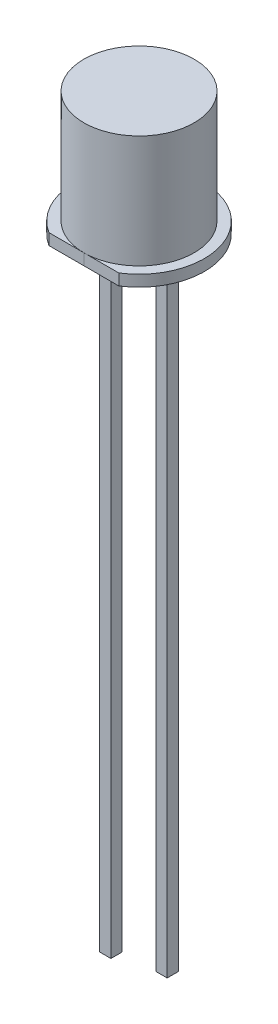
ISO-10303-21;
HEADER;
FILE_DESCRIPTION(('STEP AP214'),'2;1');
FILE_NAME('part.step','',(''),(''),'','','');
FILE_SCHEMA(('AUTOMOTIVE_DESIGN { 1 0 10303 214 1 1 1 1 }'));
ENDSEC;
DATA;
#1=APPLICATION_CONTEXT('core data for automotive mechanical design processes');
#2=APPLICATION_PROTOCOL_DEFINITION('international standard','automotive_design',2000,#1);
#3=PRODUCT_CONTEXT('',#1,'mechanical');
#4=PRODUCT('Part','Part','',(#3));
#5=PRODUCT_RELATED_PRODUCT_CATEGORY('part','',(#4));
#6=PRODUCT_DEFINITION_FORMATION('','',#4);
#7=PRODUCT_DEFINITION_CONTEXT('part definition',#1,'design');
#8=PRODUCT_DEFINITION('design','',#6,#7);
#9=PRODUCT_DEFINITION_SHAPE('','',#8);
#10=(LENGTH_UNIT() NAMED_UNIT(*) SI_UNIT(.MILLI.,.METRE.));
#11=(NAMED_UNIT(*) PLANE_ANGLE_UNIT() SI_UNIT($,.RADIAN.));
#12=(NAMED_UNIT(*) SI_UNIT($,.STERADIAN.) SOLID_ANGLE_UNIT());
#13=UNCERTAINTY_MEASURE_WITH_UNIT(LENGTH_MEASURE(1.E-05),#10,'distance_accuracy_value','');
#14=(GEOMETRIC_REPRESENTATION_CONTEXT(3) GLOBAL_UNCERTAINTY_ASSIGNED_CONTEXT((#13)) GLOBAL_UNIT_ASSIGNED_CONTEXT((#10,
#11,#12)) REPRESENTATION_CONTEXT('',''));
#15=CARTESIAN_POINT('',(0.,0.,0.));
#16=DIRECTION('',(0.,0.,1.));
#17=DIRECTION('',(1.,0.,0.));
#18=AXIS2_PLACEMENT_3D('',#15,#16,#17);
#19=CARTESIAN_POINT('',(0.,0.,-0.225));
#20=DIRECTION('',(0.,1.,0.));
#21=DIRECTION('',(1.,0.,0.));
#22=AXIS2_PLACEMENT_3D('',#19,#20,#21);
#23=PLANE('',#22);
#24=CARTESIAN_POINT('',(0.,0.,0.));
#25=DIRECTION('',(0.,1.,0.));
#26=DIRECTION('',(0.535038643075272,0.,0.844827586206897));
#27=AXIS2_PLACEMENT_3D('',#24,#25,#26);
#28=CIRCLE('',#27,2.9);
#29=CARTESIAN_POINT('',(1.55161206491829,0.,2.45));
#30=VERTEX_POINT('',#29);
#31=CARTESIAN_POINT('',(-1.55161206491829,0.,2.45));
#32=VERTEX_POINT('',#31);
#33=EDGE_CURVE('P0_E26',#30,#32,#28,.T.);
#34=ORIENTED_EDGE('',*,*,#33,.F.);
#35=DIRECTION('',(1.,0.,0.));
#36=VECTOR('',#35,1.);
#37=CARTESIAN_POINT('',(-1.55161206491829,0.,2.45));
#38=LINE('',#37,#36);
#39=CARTESIAN_POINT('',(0.,0.,2.45));
#40=VERTEX_POINT('',#39);
#41=EDGE_CURVE('P0_E101',#40,#30,#38,.T.);
#42=ORIENTED_EDGE('',*,*,#41,.F.);
#43=CARTESIAN_POINT('',(0.,0.,0.));
#44=DIRECTION('',(0.,1.,0.));
#45=DIRECTION('',(1.,0.,0.));
#46=AXIS2_PLACEMENT_3D('',#43,#44,#45);
#47=CIRCLE('',#46,2.45);
#48=CARTESIAN_POINT('',(-2.45,0.,0.));
#49=VERTEX_POINT('',#48);
#50=EDGE_CURVE('P0_E114',#40,#49,#47,.T.);
#51=ORIENTED_EDGE('',*,*,#50,.T.);
#52=CARTESIAN_POINT('',(0.,0.,0.));
#53=DIRECTION('',(0.,1.,0.));
#54=DIRECTION('',(1.,0.,0.));
#55=AXIS2_PLACEMENT_3D('',#52,#53,#54);
#56=CIRCLE('',#55,2.45);
#57=CARTESIAN_POINT('',(0.,0.,2.45));
#58=VERTEX_POINT('',#57);
#59=EDGE_CURVE('P0_E108',#49,#58,#56,.T.);
#60=ORIENTED_EDGE('',*,*,#59,.T.);
#61=DIRECTION('',(1.,0.,0.));
#62=VECTOR('',#61,1.);
#63=CARTESIAN_POINT('',(-1.55161206491829,0.,2.45));
#64=LINE('',#63,#62);
#65=EDGE_CURVE('P0_E113',#32,#58,#64,.T.);
#66=ORIENTED_EDGE('',*,*,#65,.F.);
#67=EDGE_LOOP('',(#34,#42,#51,#60,#66));
#68=FACE_BOUND('',#67,.T.);
#69=ADVANCED_FACE('P0_F16',(#68),#23,.F.);
#70=CARTESIAN_POINT('',(0.,0.5,-0.225));
#71=DIRECTION('',(0.,1.,0.));
#72=DIRECTION('',(1.,0.,0.));
#73=AXIS2_PLACEMENT_3D('',#70,#71,#72);
#74=PLANE('',#73);
#75=CARTESIAN_POINT('',(0.,0.5,0.));
#76=DIRECTION('',(0.,1.,0.));
#77=DIRECTION('',(0.535038643075272,0.,0.844827586206897));
#78=AXIS2_PLACEMENT_3D('',#75,#76,#77);
#79=CIRCLE('',#78,2.9);
#80=CARTESIAN_POINT('',(1.55161206491829,0.5,2.45));
#81=VERTEX_POINT('',#80);
#82=CARTESIAN_POINT('',(-1.55161206491829,0.5,2.45));
#83=VERTEX_POINT('',#82);
#84=EDGE_CURVE('P0_E10',#81,#83,#79,.T.);
#85=ORIENTED_EDGE('',*,*,#84,.T.);
#86=DIRECTION('',(1.,0.,0.));
#87=VECTOR('',#86,1.);
#88=CARTESIAN_POINT('',(-1.55161206491829,0.5,2.45));
#89=LINE('',#88,#87);
#90=CARTESIAN_POINT('',(0.,0.5,2.45));
#91=VERTEX_POINT('',#90);
#92=EDGE_CURVE('P0_E138',#83,#91,#89,.T.);
#93=ORIENTED_EDGE('',*,*,#92,.T.);
#94=CARTESIAN_POINT('',(0.,0.5,0.));
#95=DIRECTION('',(0.,-1.,0.));
#96=DIRECTION('',(1.,0.,0.));
#97=AXIS2_PLACEMENT_3D('',#94,#95,#96);
#98=CIRCLE('',#97,2.45);
#99=CARTESIAN_POINT('',(-2.45,0.5,0.));
#100=VERTEX_POINT('',#99);
#101=EDGE_CURVE('P0_E39',#91,#100,#98,.T.);
#102=ORIENTED_EDGE('',*,*,#101,.T.);
#103=CARTESIAN_POINT('',(0.,0.5,0.));
#104=DIRECTION('',(0.,-1.,0.));
#105=DIRECTION('',(1.,0.,0.));
#106=AXIS2_PLACEMENT_3D('',#103,#104,#105);
#107=CIRCLE('',#106,2.45);
#108=CARTESIAN_POINT('',(0.,0.5,2.45));
#109=VERTEX_POINT('',#108);
#110=EDGE_CURVE('P0_E93',#100,#109,#107,.T.);
#111=ORIENTED_EDGE('',*,*,#110,.T.);
#112=DIRECTION('',(1.,0.,0.));
#113=VECTOR('',#112,1.);
#114=CARTESIAN_POINT('',(-1.55161206491829,0.5,2.45));
#115=LINE('',#114,#113);
#116=EDGE_CURVE('P0_E92',#109,#81,#115,.T.);
#117=ORIENTED_EDGE('',*,*,#116,.T.);
#118=EDGE_LOOP('',(#85,#93,#102,#111,#117));
#119=FACE_BOUND('',#118,.T.);
#120=ADVANCED_FACE('P0_F18',(#119),#74,.T.);
#121=CARTESIAN_POINT('',(0.,0.,0.));
#122=DIRECTION('',(0.,1.,0.));
#123=DIRECTION('',(0.,0.,-1.));
#124=AXIS2_PLACEMENT_3D('',#121,#122,#123);
#125=CYLINDRICAL_SURFACE('',#124,2.9);
#126=ORIENTED_EDGE('',*,*,#33,.T.);
#127=DIRECTION('',(0.,1.,0.));
#128=VECTOR('',#127,1.);
#129=CARTESIAN_POINT('',(-1.55161206491829,0.,2.45));
#130=LINE('',#129,#128);
#131=EDGE_CURVE('P0_E87',#32,#83,#130,.T.);
#132=ORIENTED_EDGE('',*,*,#131,.T.);
#133=ORIENTED_EDGE('',*,*,#84,.F.);
#134=DIRECTION('',(0.,1.,0.));
#135=VECTOR('',#134,1.);
#136=CARTESIAN_POINT('',(1.55161206491829,0.,2.45));
#137=LINE('',#136,#135);
#138=EDGE_CURVE('P0_E84',#30,#81,#137,.T.);
#139=ORIENTED_EDGE('',*,*,#138,.F.);
#140=EDGE_LOOP('',(#126,#132,#133,#139));
#141=FACE_BOUND('',#140,.T.);
#142=ADVANCED_FACE('P0_F82',(#141),#125,.T.);
#143=CARTESIAN_POINT('',(-1.55161206491829,0.,2.45));
#144=DIRECTION('',(0.,0.,1.));
#145=DIRECTION('',(1.,0.,0.));
#146=AXIS2_PLACEMENT_3D('',#143,#144,#145);
#147=PLANE('',#146);
#148=ORIENTED_EDGE('',*,*,#65,.T.);
#149=DIRECTION('',(0.,1.,0.));
#150=VECTOR('',#149,1.);
#151=CARTESIAN_POINT('',(0.,0.,2.45));
#152=LINE('',#151,#150);
#153=EDGE_CURVE('P0_E45',#58,#91,#152,.T.);
#154=ORIENTED_EDGE('',*,*,#153,.T.);
#155=ORIENTED_EDGE('',*,*,#92,.F.);
#156=ORIENTED_EDGE('',*,*,#131,.F.);
#157=EDGE_LOOP('',(#148,#154,#155,#156));
#158=FACE_BOUND('',#157,.T.);
#159=ADVANCED_FACE('P0_F210',(#158),#147,.T.);
#160=CARTESIAN_POINT('',(0.,0.,0.));
#161=DIRECTION('',(0.,1.,0.));
#162=DIRECTION('',(1.,0.,0.));
#163=AXIS2_PLACEMENT_3D('',#160,#161,#162);
#164=CYLINDRICAL_SURFACE('',#163,2.45);
#165=DIRECTION('',(0.,-1.,0.));
#166=VECTOR('',#165,1.);
#167=CARTESIAN_POINT('',(-2.45,0.,0.));
#168=LINE('',#167,#166);
#169=EDGE_CURVE('P0_E116',#100,#49,#168,.T.);
#170=ORIENTED_EDGE('',*,*,#169,.T.);
#171=ORIENTED_EDGE('',*,*,#50,.F.);
#172=DIRECTION('',(0.,1.,0.));
#173=VECTOR('',#172,1.);
#174=CARTESIAN_POINT('',(0.,0.,2.45));
#175=LINE('',#174,#173);
#176=EDGE_CURVE('P0_E20',#40,#109,#175,.T.);
#177=ORIENTED_EDGE('',*,*,#176,.T.);
#178=ORIENTED_EDGE('',*,*,#110,.F.);
#179=EDGE_LOOP('',(#170,#171,#177,#178));
#180=FACE_BOUND('',#179,.T.);
#181=ADVANCED_FACE('P0_F200',(#180),#164,.F.);
#182=CARTESIAN_POINT('',(0.,0.,2.45));
#183=DIRECTION('',(0.,0.,1.));
#184=DIRECTION('',(1.,0.,0.));
#185=AXIS2_PLACEMENT_3D('',#182,#183,#184);
#186=PLANE('',#185);
#187=ORIENTED_EDGE('',*,*,#41,.T.);
#188=ORIENTED_EDGE('',*,*,#138,.T.);
#189=ORIENTED_EDGE('',*,*,#116,.F.);
#190=ORIENTED_EDGE('',*,*,#176,.F.);
#191=EDGE_LOOP('',(#187,#188,#189,#190));
#192=FACE_BOUND('',#191,.T.);
#193=ADVANCED_FACE('P0_F99',(#192),#186,.T.);
#194=CARTESIAN_POINT('',(0.,0.,0.));
#195=DIRECTION('',(0.,1.,0.));
#196=DIRECTION('',(1.,0.,0.));
#197=AXIS2_PLACEMENT_3D('',#194,#195,#196);
#198=CYLINDRICAL_SURFACE('',#197,2.45);
#199=ORIENTED_EDGE('',*,*,#169,.F.);
#200=ORIENTED_EDGE('',*,*,#101,.F.);
#201=ORIENTED_EDGE('',*,*,#153,.F.);
#202=ORIENTED_EDGE('',*,*,#59,.F.);
#203=EDGE_LOOP('',(#199,#200,#201,#202));
#204=FACE_BOUND('',#203,.T.);
#205=ADVANCED_FACE('P0_F183',(#204),#198,.F.);
#206=CLOSED_SHELL('',(#69,#120,#142,#159,#181,#193,#205));
#207=MANIFOLD_SOLID_BREP('P0_B1',#206);
#208=CARTESIAN_POINT('',(0.,0.,0.));
#209=DIRECTION('',(0.,1.,0.));
#210=DIRECTION('',(1.,0.,0.));
#211=AXIS2_PLACEMENT_3D('',#208,#209,#210);
#212=PLANE('',#211);
#213=CARTESIAN_POINT('',(0.,0.,0.));
#214=DIRECTION('',(0.,1.,0.));
#215=DIRECTION('',(1.,0.,0.));
#216=AXIS2_PLACEMENT_3D('',#213,#214,#215);
#217=CIRCLE('',#216,2.45);
#218=CARTESIAN_POINT('',(-2.45,0.,0.));
#219=VERTEX_POINT('',#218);
#220=EDGE_CURVE('P1_E11',#219,#219,#217,.T.);
#221=ORIENTED_EDGE('',*,*,#220,.F.);
#222=EDGE_LOOP('',(#221));
#223=FACE_BOUND('',#222,.T.);
#224=ADVANCED_FACE('P1_F17',(#223),#212,.F.);
#225=CARTESIAN_POINT('',(0.,5.5,0.));
#226=DIRECTION('',(0.,1.,0.));
#227=DIRECTION('',(1.,0.,0.));
#228=AXIS2_PLACEMENT_3D('',#225,#226,#227);
#229=PLANE('',#228);
#230=CARTESIAN_POINT('',(0.,5.5,0.));
#231=DIRECTION('',(0.,1.,0.));
#232=DIRECTION('',(1.,0.,0.));
#233=AXIS2_PLACEMENT_3D('',#230,#231,#232);
#234=CIRCLE('',#233,2.45);
#235=CARTESIAN_POINT('',(-2.45,5.5,0.));
#236=VERTEX_POINT('',#235);
#237=EDGE_CURVE('P1_E21',#236,#236,#234,.T.);
#238=ORIENTED_EDGE('',*,*,#237,.T.);
#239=EDGE_LOOP('',(#238));
#240=FACE_BOUND('',#239,.T.);
#241=ADVANCED_FACE('P1_F45',(#240),#229,.T.);
#242=CARTESIAN_POINT('',(0.,0.,0.));
#243=DIRECTION('',(0.,1.,0.));
#244=DIRECTION('',(1.,0.,0.));
#245=AXIS2_PLACEMENT_3D('',#242,#243,#244);
#246=CYLINDRICAL_SURFACE('',#245,2.45);
#247=ORIENTED_EDGE('',*,*,#237,.F.);
#248=DIRECTION('',(0.,-1.,0.));
#249=VECTOR('',#248,1.);
#250=CARTESIAN_POINT('',(-2.45,0.,0.));
#251=LINE('',#250,#249);
#252=EDGE_CURVE('P1_E28',#236,#219,#251,.T.);
#253=ORIENTED_EDGE('',*,*,#252,.T.);
#254=ORIENTED_EDGE('',*,*,#220,.T.);
#255=ORIENTED_EDGE('',*,*,#252,.F.);
#256=EDGE_LOOP('',(#247,#253,#254,#255));
#257=FACE_BOUND('',#256,.T.);
#258=ADVANCED_FACE('P1_F19',(#257),#246,.T.);
#259=CLOSED_SHELL('',(#224,#241,#258));
#260=MANIFOLD_SOLID_BREP('P1_B1',#259);
#261=CARTESIAN_POINT('',(0.,-29.,-1.25));
#262=DIRECTION('',(0.,-1.,0.));
#263=DIRECTION('',(0.,0.,-1.));
#264=AXIS2_PLACEMENT_3D('',#261,#262,#263);
#265=PLANE('',#264);
#266=DIRECTION('',(0.,0.,1.));
#267=VECTOR('',#266,1.);
#268=CARTESIAN_POINT('',(0.25,-29.,-1.));
#269=LINE('',#268,#267);
#270=CARTESIAN_POINT('',(0.25,-29.,-1.5));
#271=VERTEX_POINT('',#270);
#272=CARTESIAN_POINT('',(0.25,-29.,-1.));
#273=VERTEX_POINT('',#272);
#274=EDGE_CURVE('P2_E11',#271,#273,#269,.T.);
#275=ORIENTED_EDGE('',*,*,#274,.T.);
#276=DIRECTION('',(-1.,0.,0.));
#277=VECTOR('',#276,1.);
#278=CARTESIAN_POINT('',(-0.25,-29.,-1.));
#279=LINE('',#278,#277);
#280=CARTESIAN_POINT('',(-0.25,-29.,-1.));
#281=VERTEX_POINT('',#280);
#282=EDGE_CURVE('P2_E75',#273,#281,#279,.T.);
#283=ORIENTED_EDGE('',*,*,#282,.T.);
#284=DIRECTION('',(0.,0.,-1.));
#285=VECTOR('',#284,1.);
#286=CARTESIAN_POINT('',(-0.25,-29.,-1.5));
#287=LINE('',#286,#285);
#288=CARTESIAN_POINT('',(-0.25,-29.,-1.5));
#289=VERTEX_POINT('',#288);
#290=EDGE_CURVE('P2_E82',#281,#289,#287,.T.);
#291=ORIENTED_EDGE('',*,*,#290,.T.);
#292=DIRECTION('',(1.,0.,0.));
#293=VECTOR('',#292,1.);
#294=CARTESIAN_POINT('',(0.25,-29.,-1.5));
#295=LINE('',#294,#293);
#296=EDGE_CURVE('P2_E96',#289,#271,#295,.T.);
#297=ORIENTED_EDGE('',*,*,#296,.T.);
#298=EDGE_LOOP('',(#275,#283,#291,#297));
#299=FACE_BOUND('',#298,.T.);
#300=ADVANCED_FACE('P2_F17',(#299),#265,.T.);
#301=CARTESIAN_POINT('',(0.,0.,-1.25));
#302=DIRECTION('',(0.,1.,0.));
#303=DIRECTION('',(1.,0.,0.));
#304=AXIS2_PLACEMENT_3D('',#301,#302,#303);
#305=PLANE('',#304);
#306=DIRECTION('',(0.,0.,-1.));
#307=VECTOR('',#306,1.);
#308=CARTESIAN_POINT('',(0.25,0.,-1.));
#309=LINE('',#308,#307);
#310=CARTESIAN_POINT('',(0.25,0.,-1.));
#311=VERTEX_POINT('',#310);
#312=CARTESIAN_POINT('',(0.25,0.,-1.5));
#313=VERTEX_POINT('',#312);
#314=EDGE_CURVE('P2_E28',#311,#313,#309,.T.);
#315=ORIENTED_EDGE('',*,*,#314,.T.);
#316=DIRECTION('',(-1.,0.,0.));
#317=VECTOR('',#316,1.);
#318=CARTESIAN_POINT('',(0.25,0.,-1.5));
#319=LINE('',#318,#317);
#320=CARTESIAN_POINT('',(-0.25,0.,-1.5));
#321=VERTEX_POINT('',#320);
#322=EDGE_CURVE('P2_E87',#313,#321,#319,.T.);
#323=ORIENTED_EDGE('',*,*,#322,.T.);
#324=DIRECTION('',(0.,0.,1.));
#325=VECTOR('',#324,1.);
#326=CARTESIAN_POINT('',(-0.25,0.,-1.5));
#327=LINE('',#326,#325);
#328=CARTESIAN_POINT('',(-0.25,0.,-1.));
#329=VERTEX_POINT('',#328);
#330=EDGE_CURVE('P2_E21',#321,#329,#327,.T.);
#331=ORIENTED_EDGE('',*,*,#330,.T.);
#332=DIRECTION('',(1.,0.,0.));
#333=VECTOR('',#332,1.);
#334=CARTESIAN_POINT('',(-0.25,0.,-1.));
#335=LINE('',#334,#333);
#336=EDGE_CURVE('P2_E65',#329,#311,#335,.T.);
#337=ORIENTED_EDGE('',*,*,#336,.T.);
#338=EDGE_LOOP('',(#315,#323,#331,#337));
#339=FACE_BOUND('',#338,.T.);
#340=ADVANCED_FACE('P2_F19',(#339),#305,.T.);
#341=CARTESIAN_POINT('',(0.25,0.,-1.5));
#342=DIRECTION('',(1.,0.,0.));
#343=DIRECTION('',(0.,1.,0.));
#344=AXIS2_PLACEMENT_3D('',#341,#342,#343);
#345=PLANE('',#344);
#346=ORIENTED_EDGE('',*,*,#314,.F.);
#347=DIRECTION('',(0.,-1.,0.));
#348=VECTOR('',#347,1.);
#349=CARTESIAN_POINT('',(0.25,0.,-1.));
#350=LINE('',#349,#348);
#351=EDGE_CURVE('P2_E71',#311,#273,#350,.T.);
#352=ORIENTED_EDGE('',*,*,#351,.T.);
#353=ORIENTED_EDGE('',*,*,#274,.F.);
#354=DIRECTION('',(0.,-1.,0.));
#355=VECTOR('',#354,1.);
#356=CARTESIAN_POINT('',(0.25,0.,-1.5));
#357=LINE('',#356,#355);
#358=EDGE_CURVE('P2_E102',#313,#271,#357,.T.);
#359=ORIENTED_EDGE('',*,*,#358,.F.);
#360=EDGE_LOOP('',(#346,#352,#353,#359));
#361=FACE_BOUND('',#360,.T.);
#362=ADVANCED_FACE('P2_F125',(#361),#345,.T.);
#363=CARTESIAN_POINT('',(0.25,0.,-1.));
#364=DIRECTION('',(0.,0.,1.));
#365=DIRECTION('',(1.,0.,0.));
#366=AXIS2_PLACEMENT_3D('',#363,#364,#365);
#367=PLANE('',#366);
#368=ORIENTED_EDGE('',*,*,#336,.F.);
#369=DIRECTION('',(0.,-1.,0.));
#370=VECTOR('',#369,1.);
#371=CARTESIAN_POINT('',(-0.25,0.,-1.));
#372=LINE('',#371,#370);
#373=EDGE_CURVE('P2_E69',#329,#281,#372,.T.);
#374=ORIENTED_EDGE('',*,*,#373,.T.);
#375=ORIENTED_EDGE('',*,*,#282,.F.);
#376=ORIENTED_EDGE('',*,*,#351,.F.);
#377=EDGE_LOOP('',(#368,#374,#375,#376));
#378=FACE_BOUND('',#377,.T.);
#379=ADVANCED_FACE('P2_F67',(#378),#367,.T.);
#380=CARTESIAN_POINT('',(-0.25,0.,-1.));
#381=DIRECTION('',(-1.,0.,0.));
#382=DIRECTION('',(0.,0.,1.));
#383=AXIS2_PLACEMENT_3D('',#380,#381,#382);
#384=PLANE('',#383);
#385=ORIENTED_EDGE('',*,*,#330,.F.);
#386=DIRECTION('',(0.,-1.,0.));
#387=VECTOR('',#386,1.);
#388=CARTESIAN_POINT('',(-0.25,0.,-1.5));
#389=LINE('',#388,#387);
#390=EDGE_CURVE('P2_E89',#321,#289,#389,.T.);
#391=ORIENTED_EDGE('',*,*,#390,.T.);
#392=ORIENTED_EDGE('',*,*,#290,.F.);
#393=ORIENTED_EDGE('',*,*,#373,.F.);
#394=EDGE_LOOP('',(#385,#391,#392,#393));
#395=FACE_BOUND('',#394,.T.);
#396=ADVANCED_FACE('P2_F79',(#395),#384,.T.);
#397=CARTESIAN_POINT('',(-0.25,0.,-1.5));
#398=DIRECTION('',(0.,0.,-1.));
#399=DIRECTION('',(0.,-1.,0.));
#400=AXIS2_PLACEMENT_3D('',#397,#398,#399);
#401=PLANE('',#400);
#402=ORIENTED_EDGE('',*,*,#322,.F.);
#403=ORIENTED_EDGE('',*,*,#358,.T.);
#404=ORIENTED_EDGE('',*,*,#296,.F.);
#405=ORIENTED_EDGE('',*,*,#390,.F.);
#406=EDGE_LOOP('',(#402,#403,#404,#405));
#407=FACE_BOUND('',#406,.T.);
#408=ADVANCED_FACE('P2_F123',(#407),#401,.T.);
#409=CLOSED_SHELL('',(#300,#340,#362,#379,#396,#408));
#410=MANIFOLD_SOLID_BREP('P2_B1',#409);
#411=CARTESIAN_POINT('',(0.,-27.,1.25));
#412=DIRECTION('',(0.,-1.,0.));
#413=DIRECTION('',(0.,0.,-1.));
#414=AXIS2_PLACEMENT_3D('',#411,#412,#413);
#415=PLANE('',#414);
#416=DIRECTION('',(1.,0.,0.));
#417=VECTOR('',#416,1.);
#418=CARTESIAN_POINT('',(-0.25,-27.,1.));
#419=LINE('',#418,#417);
#420=CARTESIAN_POINT('',(-0.25,-27.,1.));
#421=VERTEX_POINT('',#420);
#422=CARTESIAN_POINT('',(0.25,-27.,1.));
#423=VERTEX_POINT('',#422);
#424=EDGE_CURVE('P3_E10',#421,#423,#419,.T.);
#425=ORIENTED_EDGE('',*,*,#424,.T.);
#426=DIRECTION('',(0.,0.,1.));
#427=VECTOR('',#426,1.);
#428=CARTESIAN_POINT('',(0.25,-27.,1.));
#429=LINE('',#428,#427);
#430=CARTESIAN_POINT('',(0.25,-27.,1.5));
#431=VERTEX_POINT('',#430);
#432=EDGE_CURVE('P3_E59',#423,#431,#429,.T.);
#433=ORIENTED_EDGE('',*,*,#432,.T.);
#434=DIRECTION('',(-1.,0.,0.));
#435=VECTOR('',#434,1.);
#436=CARTESIAN_POINT('',(0.25,-27.,1.5));
#437=LINE('',#436,#435);
#438=CARTESIAN_POINT('',(-0.25,-27.,1.5));
#439=VERTEX_POINT('',#438);
#440=EDGE_CURVE('P3_E62',#431,#439,#437,.T.);
#441=ORIENTED_EDGE('',*,*,#440,.T.);
#442=DIRECTION('',(0.,0.,-1.));
#443=VECTOR('',#442,1.);
#444=CARTESIAN_POINT('',(-0.25,-27.,1.5));
#445=LINE('',#444,#443);
#446=EDGE_CURVE('P3_E91',#439,#421,#445,.T.);
#447=ORIENTED_EDGE('',*,*,#446,.T.);
#448=EDGE_LOOP('',(#425,#433,#441,#447));
#449=FACE_BOUND('',#448,.T.);
#450=ADVANCED_FACE('P3_F16',(#449),#415,.T.);
#451=CARTESIAN_POINT('',(0.,0.,1.25));
#452=DIRECTION('',(0.,1.,0.));
#453=DIRECTION('',(1.,0.,0.));
#454=AXIS2_PLACEMENT_3D('',#451,#452,#453);
#455=PLANE('',#454);
#456=DIRECTION('',(1.,0.,0.));
#457=VECTOR('',#456,1.);
#458=CARTESIAN_POINT('',(-0.25,0.,1.));
#459=LINE('',#458,#457);
#460=CARTESIAN_POINT('',(-0.25,0.,1.));
#461=VERTEX_POINT('',#460);
#462=CARTESIAN_POINT('',(0.25,0.,1.));
#463=VERTEX_POINT('',#462);
#464=EDGE_CURVE('P3_E27',#461,#463,#459,.T.);
#465=ORIENTED_EDGE('',*,*,#464,.F.);
#466=DIRECTION('',(0.,0.,-1.));
#467=VECTOR('',#466,1.);
#468=CARTESIAN_POINT('',(-0.25,0.,1.5));
#469=LINE('',#468,#467);
#470=CARTESIAN_POINT('',(-0.25,0.,1.5));
#471=VERTEX_POINT('',#470);
#472=EDGE_CURVE('P3_E97',#471,#461,#469,.T.);
#473=ORIENTED_EDGE('',*,*,#472,.F.);
#474=DIRECTION('',(-1.,0.,0.));
#475=VECTOR('',#474,1.);
#476=CARTESIAN_POINT('',(0.25,0.,1.5));
#477=LINE('',#476,#475);
#478=CARTESIAN_POINT('',(0.25,0.,1.5));
#479=VERTEX_POINT('',#478);
#480=EDGE_CURVE('P3_E82',#479,#471,#477,.T.);
#481=ORIENTED_EDGE('',*,*,#480,.F.);
#482=DIRECTION('',(0.,0.,1.));
#483=VECTOR('',#482,1.);
#484=CARTESIAN_POINT('',(0.25,0.,1.));
#485=LINE('',#484,#483);
#486=EDGE_CURVE('P3_E67',#463,#479,#485,.T.);
#487=ORIENTED_EDGE('',*,*,#486,.F.);
#488=EDGE_LOOP('',(#465,#473,#481,#487));
#489=FACE_BOUND('',#488,.T.);
#490=ADVANCED_FACE('P3_F125',(#489),#455,.T.);
#491=CARTESIAN_POINT('',(-0.25,0.,1.));
#492=DIRECTION('',(0.,0.,-1.));
#493=DIRECTION('',(0.,-1.,0.));
#494=AXIS2_PLACEMENT_3D('',#491,#492,#493);
#495=PLANE('',#494);
#496=ORIENTED_EDGE('',*,*,#464,.T.);
#497=DIRECTION('',(0.,-1.,0.));
#498=VECTOR('',#497,1.);
#499=CARTESIAN_POINT('',(0.25,0.,1.));
#500=LINE('',#499,#498);
#501=EDGE_CURVE('P3_E20',#463,#423,#500,.T.);
#502=ORIENTED_EDGE('',*,*,#501,.T.);
#503=ORIENTED_EDGE('',*,*,#424,.F.);
#504=DIRECTION('',(0.,-1.,0.));
#505=VECTOR('',#504,1.);
#506=CARTESIAN_POINT('',(-0.25,0.,1.));
#507=LINE('',#506,#505);
#508=EDGE_CURVE('P3_E100',#461,#421,#507,.T.);
#509=ORIENTED_EDGE('',*,*,#508,.F.);
#510=EDGE_LOOP('',(#496,#502,#503,#509));
#511=FACE_BOUND('',#510,.T.);
#512=ADVANCED_FACE('P3_F117',(#511),#495,.T.);
#513=CARTESIAN_POINT('',(0.25,0.,1.));
#514=DIRECTION('',(1.,0.,0.));
#515=DIRECTION('',(0.,1.,0.));
#516=AXIS2_PLACEMENT_3D('',#513,#514,#515);
#517=PLANE('',#516);
#518=ORIENTED_EDGE('',*,*,#486,.T.);
#519=DIRECTION('',(0.,-1.,0.));
#520=VECTOR('',#519,1.);
#521=CARTESIAN_POINT('',(0.25,0.,1.5));
#522=LINE('',#521,#520);
#523=EDGE_CURVE('P3_E70',#479,#431,#522,.T.);
#524=ORIENTED_EDGE('',*,*,#523,.T.);
#525=ORIENTED_EDGE('',*,*,#432,.F.);
#526=ORIENTED_EDGE('',*,*,#501,.F.);
#527=EDGE_LOOP('',(#518,#524,#525,#526));
#528=FACE_BOUND('',#527,.T.);
#529=ADVANCED_FACE('P3_F71',(#528),#517,.T.);
#530=CARTESIAN_POINT('',(0.25,0.,1.5));
#531=DIRECTION('',(0.,0.,1.));
#532=DIRECTION('',(1.,0.,0.));
#533=AXIS2_PLACEMENT_3D('',#530,#531,#532);
#534=PLANE('',#533);
#535=ORIENTED_EDGE('',*,*,#480,.T.);
#536=DIRECTION('',(0.,-1.,0.));
#537=VECTOR('',#536,1.);
#538=CARTESIAN_POINT('',(-0.25,0.,1.5));
#539=LINE('',#538,#537);
#540=EDGE_CURVE('P3_E79',#471,#439,#539,.T.);
#541=ORIENTED_EDGE('',*,*,#540,.T.);
#542=ORIENTED_EDGE('',*,*,#440,.F.);
#543=ORIENTED_EDGE('',*,*,#523,.F.);
#544=EDGE_LOOP('',(#535,#541,#542,#543));
#545=FACE_BOUND('',#544,.T.);
#546=ADVANCED_FACE('P3_F77',(#545),#534,.T.);
#547=CARTESIAN_POINT('',(-0.25,0.,1.5));
#548=DIRECTION('',(-1.,0.,0.));
#549=DIRECTION('',(0.,0.,1.));
#550=AXIS2_PLACEMENT_3D('',#547,#548,#549);
#551=PLANE('',#550);
#552=ORIENTED_EDGE('',*,*,#472,.T.);
#553=ORIENTED_EDGE('',*,*,#508,.T.);
#554=ORIENTED_EDGE('',*,*,#446,.F.);
#555=ORIENTED_EDGE('',*,*,#540,.F.);
#556=EDGE_LOOP('',(#552,#553,#554,#555));
#557=FACE_BOUND('',#556,.T.);
#558=ADVANCED_FACE('P3_F18',(#557),#551,.T.);
#559=CLOSED_SHELL('',(#450,#490,#512,#529,#546,#558));
#560=MANIFOLD_SOLID_BREP('P3_B1',#559);
#561=ADVANCED_BREP_SHAPE_REPRESENTATION('',(#18,#207,#260,#410,#560),#14);
#562=SHAPE_DEFINITION_REPRESENTATION(#9,#561);
ENDSEC;
END-ISO-10303-21;
